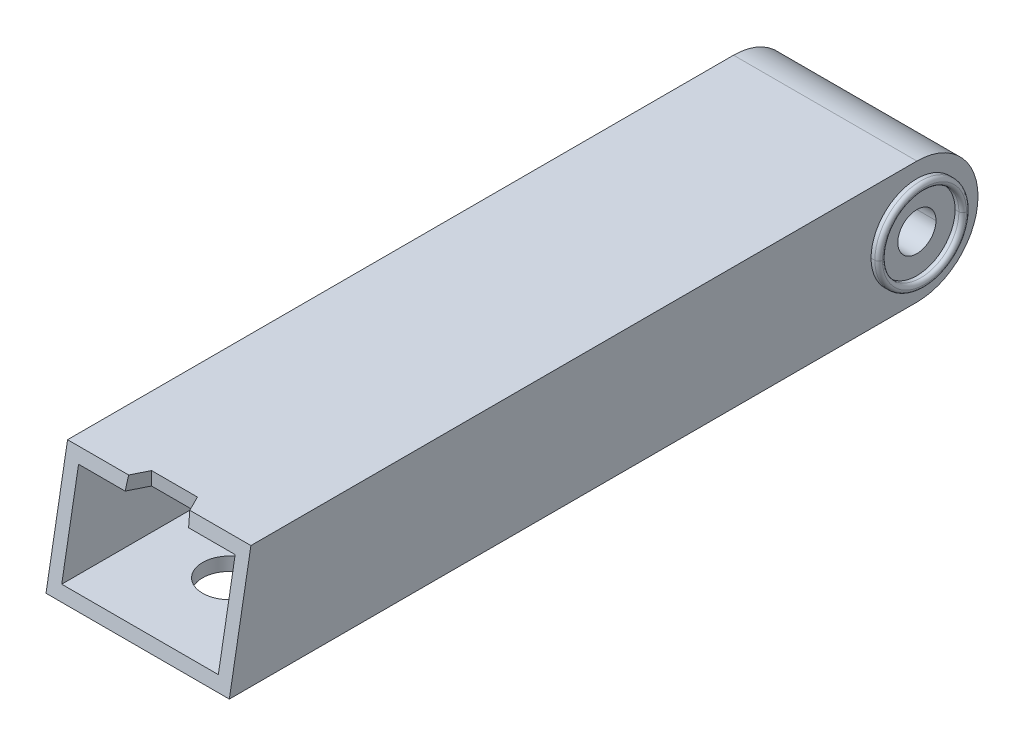
ISO-10303-21;
HEADER;
FILE_DESCRIPTION(('STEP AP214'),'2;1');
FILE_NAME('part.step','',(''),(''),'','','');
FILE_SCHEMA(('AUTOMOTIVE_DESIGN { 1 0 10303 214 1 1 1 1 }'));
ENDSEC;
DATA;
#1=APPLICATION_CONTEXT('core data for automotive mechanical design processes');
#2=APPLICATION_PROTOCOL_DEFINITION('international standard','automotive_design',2000,#1);
#3=PRODUCT_CONTEXT('',#1,'mechanical');
#4=PRODUCT('Part','Part','',(#3));
#5=PRODUCT_RELATED_PRODUCT_CATEGORY('part','',(#4));
#6=PRODUCT_DEFINITION_FORMATION('','',#4);
#7=PRODUCT_DEFINITION_CONTEXT('part definition',#1,'design');
#8=PRODUCT_DEFINITION('design','',#6,#7);
#9=PRODUCT_DEFINITION_SHAPE('','',#8);
#10=(LENGTH_UNIT() NAMED_UNIT(*) SI_UNIT(.MILLI.,.METRE.));
#11=(NAMED_UNIT(*) PLANE_ANGLE_UNIT() SI_UNIT($,.RADIAN.));
#12=(NAMED_UNIT(*) SI_UNIT($,.STERADIAN.) SOLID_ANGLE_UNIT());
#13=UNCERTAINTY_MEASURE_WITH_UNIT(LENGTH_MEASURE(1.E-05),#10,'distance_accuracy_value','');
#14=(GEOMETRIC_REPRESENTATION_CONTEXT(3) GLOBAL_UNCERTAINTY_ASSIGNED_CONTEXT((#13)) GLOBAL_UNIT_ASSIGNED_CONTEXT((#10,
#11,#12)) REPRESENTATION_CONTEXT('',''));
#15=CARTESIAN_POINT('',(0.,0.,0.));
#16=DIRECTION('',(0.,0.,1.));
#17=DIRECTION('',(1.,0.,0.));
#18=AXIS2_PLACEMENT_3D('',#15,#16,#17);
#19=CARTESIAN_POINT('',(9.,6.,85.1787683086646));
#20=DIRECTION('',(0.,0.,-1.));
#21=DIRECTION('',(0.,-1.,0.));
#22=AXIS2_PLACEMENT_3D('',#19,#20,#21);
#23=PLANE('',#22);
#24=DIRECTION('',(1.,0.,0.));
#25=VECTOR('',#24,1.);
#26=CARTESIAN_POINT('',(1.75,14.25,85.1787683086646));
#27=LINE('',#26,#25);
#28=CARTESIAN_POINT('',(9.,14.25,85.1787683086646));
#29=VERTEX_POINT('',#28);
#30=CARTESIAN_POINT('',(15.,14.25,85.1787683086646));
#31=VERTEX_POINT('',#30);
#32=EDGE_CURVE('E321',#29,#31,#27,.T.);
#33=ORIENTED_EDGE('',*,*,#32,.T.);
#34=DIRECTION('',(0.,1.,0.));
#35=VECTOR('',#34,1.);
#36=CARTESIAN_POINT('',(15.,6.,85.1787683086646));
#37=LINE('',#36,#35);
#38=CARTESIAN_POINT('',(15.,16.,85.1787683086646));
#39=VERTEX_POINT('',#38);
#40=EDGE_CURVE('E11',#31,#39,#37,.T.);
#41=ORIENTED_EDGE('',*,*,#40,.T.);
#42=DIRECTION('',(-1.,0.,0.));
#43=VECTOR('',#42,1.);
#44=CARTESIAN_POINT('',(9.,16.,85.1787683086646));
#45=LINE('',#44,#43);
#46=CARTESIAN_POINT('',(9.,16.,85.1787683086646));
#47=VERTEX_POINT('',#46);
#48=EDGE_CURVE('E415',#39,#47,#45,.T.);
#49=ORIENTED_EDGE('',*,*,#48,.T.);
#50=DIRECTION('',(0.,1.,0.));
#51=VECTOR('',#50,1.);
#52=CARTESIAN_POINT('',(9.,6.,85.1787683086646));
#53=LINE('',#52,#51);
#54=EDGE_CURVE('E27',#29,#47,#53,.T.);
#55=ORIENTED_EDGE('',*,*,#54,.F.);
#56=EDGE_LOOP('',(#33,#41,#49,#55));
#57=FACE_BOUND('',#56,.T.);
#58=ADVANCED_FACE('F16',(#57),#23,.F.);
#59=CARTESIAN_POINT('',(15.,6.,85.1787683086646));
#60=DIRECTION('',(0.894427190999916,0.,-0.447213595499958));
#61=DIRECTION('',(0.,-1.,0.));
#62=AXIS2_PLACEMENT_3D('',#59,#60,#61);
#63=PLANE('',#62);
#64=DIRECTION('',(-0.447213595499958,0.,-0.894427190999916));
#65=VECTOR('',#64,1.);
#66=CARTESIAN_POINT('',(15.,16.,85.1787683086646));
#67=LINE('',#66,#65);
#68=CARTESIAN_POINT('',(16.,16.,87.1787683086646));
#69=VERTEX_POINT('',#68);
#70=EDGE_CURVE('E372',#69,#39,#67,.T.);
#71=ORIENTED_EDGE('',*,*,#70,.T.);
#72=ORIENTED_EDGE('',*,*,#40,.F.);
#73=DIRECTION('',(0.447213595499958,0.,0.894427190999916));
#74=VECTOR('',#73,1.);
#75=CARTESIAN_POINT('',(14.2784926765342,14.25,83.7357536617329));
#76=LINE('',#75,#74);
#77=CARTESIAN_POINT('',(16.1542861081199,14.25,87.4873405249044));
#78=VERTEX_POINT('',#77);
#79=EDGE_CURVE('E375',#31,#78,#76,.T.);
#80=ORIENTED_EDGE('',*,*,#79,.T.);
#81=DIRECTION('',(0.086498669216755,-0.981116660300217,0.17299733843351));
#82=VECTOR('',#81,1.);
#83=CARTESIAN_POINT('',(16.0673381779864,15.2362124308388,87.3134446646374));
#84=LINE('',#83,#82);
#85=EDGE_CURVE('E280',#69,#78,#84,.T.);
#86=ORIENTED_EDGE('',*,*,#85,.F.);
#87=EDGE_LOOP('',(#71,#72,#80,#86));
#88=FACE_BOUND('',#87,.T.);
#89=ADVANCED_FACE('F1058',(#88),#63,.F.);
#90=CARTESIAN_POINT('',(6.,6.,91.1787683086646));
#91=DIRECTION('',(-0.894427190999916,0.,-0.447213595499958));
#92=DIRECTION('',(-0.447213595499958,0.,0.894427190999916));
#93=AXIS2_PLACEMENT_3D('',#90,#91,#92);
#94=PLANE('',#93);
#95=DIRECTION('',(0.447213595499958,0.,-0.894427190999916));
#96=VECTOR('',#95,1.);
#97=CARTESIAN_POINT('',(5.62150732346583,14.25,91.9357536617329));
#98=LINE('',#97,#96);
#99=CARTESIAN_POINT('',(7.8457138918801,14.25,87.4873405249044));
#100=VERTEX_POINT('',#99);
#101=EDGE_CURVE('E318',#100,#29,#98,.T.);
#102=ORIENTED_EDGE('',*,*,#101,.T.);
#103=ORIENTED_EDGE('',*,*,#54,.T.);
#104=DIRECTION('',(-0.447213595499958,0.,0.894427190999916));
#105=VECTOR('',#104,1.);
#106=CARTESIAN_POINT('',(6.,16.,91.1787683086646));
#107=LINE('',#106,#105);
#108=CARTESIAN_POINT('',(8.,16.,87.1787683086646));
#109=VERTEX_POINT('',#108);
#110=EDGE_CURVE('E293',#47,#109,#107,.T.);
#111=ORIENTED_EDGE('',*,*,#110,.T.);
#112=DIRECTION('',(0.086498669216755,0.981116660300217,-0.17299733843351));
#113=VECTOR('',#112,1.);
#114=CARTESIAN_POINT('',(8.12719433619659,17.4427098528601,86.9243796362714));
#115=LINE('',#114,#113);
#116=EDGE_CURVE('E408',#100,#109,#115,.T.);
#117=ORIENTED_EDGE('',*,*,#116,.F.);
#118=EDGE_LOOP('',(#102,#103,#111,#117));
#119=FACE_BOUND('',#118,.T.);
#120=ADVANCED_FACE('F706',(#119),#94,.F.);
#121=CARTESIAN_POINT('',(24.5,8.,0.));
#122=DIRECTION('',(1.,0.,0.));
#123=DIRECTION('',(0.,0.,-1.));
#124=AXIS2_PLACEMENT_3D('',#121,#122,#123);
#125=TOROIDAL_SURFACE('',#124,5.5,0.5);
#126=CARTESIAN_POINT('',(24.5,8.,5.5));
#127=DIRECTION('',(0.,1.,0.));
#128=DIRECTION('',(0.,0.,1.));
#129=AXIS2_PLACEMENT_3D('',#126,#127,#128);
#130=CIRCLE('',#129,0.5);
#131=CARTESIAN_POINT('',(25.,8.,5.5));
#132=VERTEX_POINT('',#131);
#133=CARTESIAN_POINT('',(24.5,8.,5.));
#134=VERTEX_POINT('',#133);
#135=EDGE_CURVE('E328',#132,#134,#130,.T.);
#136=ORIENTED_EDGE('',*,*,#135,.F.);
#137=CARTESIAN_POINT('',(25.,8.,0.));
#138=DIRECTION('',(1.,0.,0.));
#139=DIRECTION('',(0.,0.,-1.));
#140=AXIS2_PLACEMENT_3D('',#137,#138,#139);
#141=CIRCLE('',#140,5.5);
#142=CARTESIAN_POINT('',(25.,8.,-5.5));
#143=VERTEX_POINT('',#142);
#144=EDGE_CURVE('E448',#132,#143,#141,.T.);
#145=ORIENTED_EDGE('',*,*,#144,.T.);
#146=CARTESIAN_POINT('',(24.5,8.,-5.5));
#147=DIRECTION('',(0.,-1.,0.));
#148=DIRECTION('',(0.,0.,-1.));
#149=AXIS2_PLACEMENT_3D('',#146,#147,#148);
#150=CIRCLE('',#149,0.5);
#151=CARTESIAN_POINT('',(24.5,8.,-5.));
#152=VERTEX_POINT('',#151);
#153=EDGE_CURVE('E337',#143,#152,#150,.T.);
#154=ORIENTED_EDGE('',*,*,#153,.T.);
#155=CARTESIAN_POINT('',(24.5,8.,0.));
#156=DIRECTION('',(1.,0.,0.));
#157=DIRECTION('',(0.,0.,-1.));
#158=AXIS2_PLACEMENT_3D('',#155,#156,#157);
#159=CIRCLE('',#158,5.);
#160=EDGE_CURVE('E392',#134,#152,#159,.T.);
#161=ORIENTED_EDGE('',*,*,#160,.F.);
#162=EDGE_LOOP('',(#136,#145,#154,#161));
#163=FACE_BOUND('',#162,.T.);
#164=ADVANCED_FACE('F674',(#163),#125,.T.);
#165=CARTESIAN_POINT('',(24.5,8.,0.));
#166=DIRECTION('',(1.,0.,0.));
#167=DIRECTION('',(0.,0.,-1.));
#168=AXIS2_PLACEMENT_3D('',#165,#166,#167);
#169=TOROIDAL_SURFACE('',#168,5.5,0.5);
#170=CARTESIAN_POINT('',(24.5,8.,5.5));
#171=DIRECTION('',(0.,1.,0.));
#172=DIRECTION('',(0.,0.,1.));
#173=AXIS2_PLACEMENT_3D('',#170,#171,#172);
#174=CIRCLE('',#173,0.5);
#175=CARTESIAN_POINT('',(24.5,8.,6.));
#176=VERTEX_POINT('',#175);
#177=EDGE_CURVE('E294',#176,#132,#174,.T.);
#178=ORIENTED_EDGE('',*,*,#177,.F.);
#179=CARTESIAN_POINT('',(24.5,8.,0.));
#180=DIRECTION('',(-1.,0.,0.));
#181=DIRECTION('',(0.,0.,-1.));
#182=AXIS2_PLACEMENT_3D('',#179,#180,#181);
#183=CIRCLE('',#182,6.);
#184=CARTESIAN_POINT('',(24.5,8.,-6.));
#185=VERTEX_POINT('',#184);
#186=EDGE_CURVE('E309',#185,#176,#183,.T.);
#187=ORIENTED_EDGE('',*,*,#186,.F.);
#188=CARTESIAN_POINT('',(24.5,8.,-5.5));
#189=DIRECTION('',(0.,-1.,0.));
#190=DIRECTION('',(0.,0.,-1.));
#191=AXIS2_PLACEMENT_3D('',#188,#189,#190);
#192=CIRCLE('',#191,0.5);
#193=EDGE_CURVE('E298',#185,#143,#192,.T.);
#194=ORIENTED_EDGE('',*,*,#193,.T.);
#195=ORIENTED_EDGE('',*,*,#144,.F.);
#196=EDGE_LOOP('',(#178,#187,#194,#195));
#197=FACE_BOUND('',#196,.T.);
#198=ADVANCED_FACE('F663',(#197),#169,.T.);
#199=CARTESIAN_POINT('',(-0.5,8.,0.));
#200=DIRECTION('',(-1.,0.,0.));
#201=DIRECTION('',(0.,0.,1.));
#202=AXIS2_PLACEMENT_3D('',#199,#200,#201);
#203=TOROIDAL_SURFACE('',#202,5.5,0.5);
#204=CARTESIAN_POINT('',(-0.5,8.,-5.5));
#205=DIRECTION('',(0.,1.,0.));
#206=DIRECTION('',(0.,0.,1.));
#207=AXIS2_PLACEMENT_3D('',#204,#205,#206);
#208=CIRCLE('',#207,0.5);
#209=CARTESIAN_POINT('',(-0.5,8.,-6.));
#210=VERTEX_POINT('',#209);
#211=CARTESIAN_POINT('',(-1.,8.,-5.5));
#212=VERTEX_POINT('',#211);
#213=EDGE_CURVE('E364',#210,#212,#208,.T.);
#214=ORIENTED_EDGE('',*,*,#213,.F.);
#215=CARTESIAN_POINT('',(-0.5,8.,0.));
#216=DIRECTION('',(1.,0.,0.));
#217=DIRECTION('',(0.,0.,1.));
#218=AXIS2_PLACEMENT_3D('',#215,#216,#217);
#219=CIRCLE('',#218,6.);
#220=CARTESIAN_POINT('',(-0.5,8.,6.));
#221=VERTEX_POINT('',#220);
#222=EDGE_CURVE('E412',#221,#210,#219,.T.);
#223=ORIENTED_EDGE('',*,*,#222,.F.);
#224=CARTESIAN_POINT('',(-0.5,8.,5.5));
#225=DIRECTION('',(0.,-1.,0.));
#226=DIRECTION('',(0.,0.,-1.));
#227=AXIS2_PLACEMENT_3D('',#224,#225,#226);
#228=CIRCLE('',#227,0.5);
#229=CARTESIAN_POINT('',(-1.,8.,5.5));
#230=VERTEX_POINT('',#229);
#231=EDGE_CURVE('E460',#221,#230,#228,.T.);
#232=ORIENTED_EDGE('',*,*,#231,.T.);
#233=CARTESIAN_POINT('',(-1.,8.,0.));
#234=DIRECTION('',(-1.,0.,0.));
#235=DIRECTION('',(0.,0.,1.));
#236=AXIS2_PLACEMENT_3D('',#233,#234,#235);
#237=CIRCLE('',#236,5.5);
#238=EDGE_CURVE('E409',#212,#230,#237,.T.);
#239=ORIENTED_EDGE('',*,*,#238,.F.);
#240=EDGE_LOOP('',(#214,#223,#232,#239));
#241=FACE_BOUND('',#240,.T.);
#242=ADVANCED_FACE('F474',(#241),#203,.T.);
#243=CARTESIAN_POINT('',(12.,10.,78.));
#244=DIRECTION('',(0.,-1.,0.));
#245=DIRECTION('',(0.,0.,-1.));
#246=AXIS2_PLACEMENT_3D('',#243,#244,#245);
#247=CYLINDRICAL_SURFACE('',#246,3.5);
#248=DIRECTION('',(0.,-1.,0.));
#249=VECTOR('',#248,1.);
#250=CARTESIAN_POINT('',(12.,10.,81.5));
#251=LINE('',#250,#249);
#252=CARTESIAN_POINT('',(12.,1.75,81.5));
#253=VERTEX_POINT('',#252);
#254=CARTESIAN_POINT('',(12.,0.,81.5));
#255=VERTEX_POINT('',#254);
#256=EDGE_CURVE('E444',#253,#255,#251,.T.);
#257=ORIENTED_EDGE('',*,*,#256,.F.);
#258=CARTESIAN_POINT('',(12.,1.75,78.));
#259=DIRECTION('',(0.,1.,0.));
#260=DIRECTION('',(-1.,0.,0.));
#261=AXIS2_PLACEMENT_3D('',#258,#259,#260);
#262=CIRCLE('',#261,3.5);
#263=CARTESIAN_POINT('',(12.,1.75,74.5));
#264=VERTEX_POINT('',#263);
#265=EDGE_CURVE('E163',#253,#264,#262,.T.);
#266=ORIENTED_EDGE('',*,*,#265,.T.);
#267=DIRECTION('',(0.,-1.,0.));
#268=VECTOR('',#267,1.);
#269=CARTESIAN_POINT('',(12.,10.,74.5));
#270=LINE('',#269,#268);
#271=CARTESIAN_POINT('',(12.,0.,74.5));
#272=VERTEX_POINT('',#271);
#273=EDGE_CURVE('E284',#264,#272,#270,.T.);
#274=ORIENTED_EDGE('',*,*,#273,.T.);
#275=CARTESIAN_POINT('',(12.,0.,78.));
#276=DIRECTION('',(0.,-1.,0.));
#277=DIRECTION('',(0.,0.,-1.));
#278=AXIS2_PLACEMENT_3D('',#275,#276,#277);
#279=CIRCLE('',#278,3.5);
#280=EDGE_CURVE('E397',#272,#255,#279,.T.);
#281=ORIENTED_EDGE('',*,*,#280,.T.);
#282=EDGE_LOOP('',(#257,#266,#274,#281));
#283=FACE_BOUND('',#282,.T.);
#284=ADVANCED_FACE('F1043',(#283),#247,.F.);
#285=CARTESIAN_POINT('',(1.75,1.75,90.));
#286=DIRECTION('',(1.,0.,0.));
#287=DIRECTION('',(0.,1.,0.));
#288=AXIS2_PLACEMENT_3D('',#285,#286,#287);
#289=PLANE('',#288);
#290=DIRECTION('',(0.,0.984807753012208,-0.17364817766693));
#291=VECTOR('',#290,1.);
#292=CARTESIAN_POINT('',(1.75,1.69723104318767,89.70073237459));
#293=LINE('',#292,#291);
#294=CARTESIAN_POINT('',(1.75,1.75,89.6914277837602));
#295=VERTEX_POINT('',#294);
#296=CARTESIAN_POINT('',(1.75,14.25,87.4873405249044));
#297=VERTEX_POINT('',#296);
#298=EDGE_CURVE('E255',#295,#297,#293,.T.);
#299=ORIENTED_EDGE('',*,*,#298,.F.);
#300=DIRECTION('',(0.,0.,-1.));
#301=VECTOR('',#300,1.);
#302=CARTESIAN_POINT('',(1.75,1.75,90.));
#303=LINE('',#302,#301);
#304=CARTESIAN_POINT('',(1.75,1.75,4.99374608885958));
#305=VERTEX_POINT('',#304);
#306=EDGE_CURVE('E241',#295,#305,#303,.T.);
#307=ORIENTED_EDGE('',*,*,#306,.T.);
#308=CARTESIAN_POINT('',(1.75,8.,0.));
#309=DIRECTION('',(1.,0.,0.));
#310=DIRECTION('',(0.,0.,-1.));
#311=AXIS2_PLACEMENT_3D('',#308,#309,#310);
#312=CIRCLE('',#311,8.);
#313=CARTESIAN_POINT('',(1.75,14.25,4.99374608885955));
#314=VERTEX_POINT('',#313);
#315=EDGE_CURVE('E314',#314,#305,#312,.T.);
#316=ORIENTED_EDGE('',*,*,#315,.F.);
#317=DIRECTION('',(0.,0.,-1.));
#318=VECTOR('',#317,1.);
#319=CARTESIAN_POINT('',(1.75,14.25,90.));
#320=LINE('',#319,#318);
#321=EDGE_CURVE('E257',#297,#314,#320,.T.);
#322=ORIENTED_EDGE('',*,*,#321,.F.);
#323=EDGE_LOOP('',(#299,#307,#316,#322));
#324=FACE_BOUND('',#323,.T.);
#325=ADVANCED_FACE('F256',(#324),#289,.T.);
#326=CARTESIAN_POINT('',(1.75,1.75,90.));
#327=DIRECTION('',(0.,1.,0.));
#328=DIRECTION('',(1.,0.,0.));
#329=AXIS2_PLACEMENT_3D('',#326,#327,#328);
#330=PLANE('',#329);
#331=CARTESIAN_POINT('',(12.,1.75,78.));
#332=DIRECTION('',(0.,1.,0.));
#333=DIRECTION('',(-1.,0.,0.));
#334=AXIS2_PLACEMENT_3D('',#331,#332,#333);
#335=CIRCLE('',#334,3.5);
#336=EDGE_CURVE('E691',#264,#253,#335,.T.);
#337=ORIENTED_EDGE('',*,*,#336,.F.);
#338=ORIENTED_EDGE('',*,*,#265,.F.);
#339=EDGE_LOOP('',(#337,#338));
#340=FACE_BOUND('',#339,.T.);
#341=DIRECTION('',(-1.,0.,0.));
#342=VECTOR('',#341,1.);
#343=CARTESIAN_POINT('',(1.75,1.75,89.6914277837602));
#344=LINE('',#343,#342);
#345=CARTESIAN_POINT('',(22.25,1.75,89.6914277837602));
#346=VERTEX_POINT('',#345);
#347=EDGE_CURVE('E20',#346,#295,#344,.T.);
#348=ORIENTED_EDGE('',*,*,#347,.F.);
#349=DIRECTION('',(0.,0.,-1.));
#350=VECTOR('',#349,1.);
#351=CARTESIAN_POINT('',(22.25,1.75,90.));
#352=LINE('',#351,#350);
#353=CARTESIAN_POINT('',(22.25,1.75,4.99374608885955));
#354=VERTEX_POINT('',#353);
#355=EDGE_CURVE('E233',#346,#354,#352,.T.);
#356=ORIENTED_EDGE('',*,*,#355,.T.);
#357=DIRECTION('',(1.,0.,0.));
#358=VECTOR('',#357,1.);
#359=CARTESIAN_POINT('',(-22.6274169979695,1.75,4.99374608885955));
#360=LINE('',#359,#358);
#361=EDGE_CURVE('E247',#305,#354,#360,.T.);
#362=ORIENTED_EDGE('',*,*,#361,.F.);
#363=ORIENTED_EDGE('',*,*,#306,.F.);
#364=EDGE_LOOP('',(#348,#356,#362,#363));
#365=FACE_BOUND('',#364,.T.);
#366=ADVANCED_FACE('F243',(#340,#365),#330,.T.);
#367=CARTESIAN_POINT('',(22.25,1.75,90.));
#368=DIRECTION('',(-1.,0.,0.));
#369=DIRECTION('',(0.,0.,1.));
#370=AXIS2_PLACEMENT_3D('',#367,#368,#369);
#371=PLANE('',#370);
#372=DIRECTION('',(0.,-0.984807753012208,0.17364817766693));
#373=VECTOR('',#372,1.);
#374=CARTESIAN_POINT('',(22.25,1.69723104318767,89.70073237459));
#375=LINE('',#374,#373);
#376=CARTESIAN_POINT('',(22.25,14.25,87.4873405249044));
#377=VERTEX_POINT('',#376);
#378=EDGE_CURVE('E266',#377,#346,#375,.T.);
#379=ORIENTED_EDGE('',*,*,#378,.F.);
#380=DIRECTION('',(0.,0.,-1.));
#381=VECTOR('',#380,1.);
#382=CARTESIAN_POINT('',(22.25,14.25,90.));
#383=LINE('',#382,#381);
#384=CARTESIAN_POINT('',(22.25,14.25,4.99374608885958));
#385=VERTEX_POINT('',#384);
#386=EDGE_CURVE('E451',#377,#385,#383,.T.);
#387=ORIENTED_EDGE('',*,*,#386,.T.);
#388=CARTESIAN_POINT('',(22.25,8.,0.));
#389=DIRECTION('',(-1.,0.,0.));
#390=DIRECTION('',(0.,0.,1.));
#391=AXIS2_PLACEMENT_3D('',#388,#389,#390);
#392=CIRCLE('',#391,8.);
#393=EDGE_CURVE('E313',#354,#385,#392,.T.);
#394=ORIENTED_EDGE('',*,*,#393,.F.);
#395=ORIENTED_EDGE('',*,*,#355,.F.);
#396=EDGE_LOOP('',(#379,#387,#394,#395));
#397=FACE_BOUND('',#396,.T.);
#398=ADVANCED_FACE('F555',(#397),#371,.T.);
#399=CARTESIAN_POINT('',(1.75,14.25,90.));
#400=DIRECTION('',(0.,-1.,0.));
#401=DIRECTION('',(0.,0.,-1.));
#402=AXIS2_PLACEMENT_3D('',#399,#400,#401);
#403=PLANE('',#402);
#404=ORIENTED_EDGE('',*,*,#101,.F.);
#405=DIRECTION('',(1.,0.,0.));
#406=VECTOR('',#405,1.);
#407=CARTESIAN_POINT('',(1.75,14.25,87.4873405249044));
#408=LINE('',#407,#406);
#409=EDGE_CURVE('E518',#297,#100,#408,.T.);
#410=ORIENTED_EDGE('',*,*,#409,.F.);
#411=ORIENTED_EDGE('',*,*,#321,.T.);
#412=DIRECTION('',(-1.,0.,0.));
#413=VECTOR('',#412,1.);
#414=CARTESIAN_POINT('',(-22.6274169979695,14.25,4.99374608885955));
#415=LINE('',#414,#413);
#416=EDGE_CURVE('E262',#385,#314,#415,.T.);
#417=ORIENTED_EDGE('',*,*,#416,.F.);
#418=ORIENTED_EDGE('',*,*,#386,.F.);
#419=DIRECTION('',(1.,0.,0.));
#420=VECTOR('',#419,1.);
#421=CARTESIAN_POINT('',(1.75,14.25,87.4873405249044));
#422=LINE('',#421,#420);
#423=EDGE_CURVE('E273',#78,#377,#422,.T.);
#424=ORIENTED_EDGE('',*,*,#423,.F.);
#425=ORIENTED_EDGE('',*,*,#79,.F.);
#426=ORIENTED_EDGE('',*,*,#32,.F.);
#427=EDGE_LOOP('',(#404,#410,#411,#417,#418,#424,#425,#426));
#428=FACE_BOUND('',#427,.T.);
#429=ADVANCED_FACE('F553',(#428),#403,.T.);
#430=CARTESIAN_POINT('',(-22.6274169979695,8.,0.));
#431=DIRECTION('',(1.,0.,0.));
#432=DIRECTION('',(0.,0.,-1.));
#433=AXIS2_PLACEMENT_3D('',#430,#431,#432);
#434=CYLINDRICAL_SURFACE('',#433,8.);
#435=ORIENTED_EDGE('',*,*,#416,.T.);
#436=ORIENTED_EDGE('',*,*,#315,.T.);
#437=ORIENTED_EDGE('',*,*,#361,.T.);
#438=ORIENTED_EDGE('',*,*,#393,.T.);
#439=EDGE_LOOP('',(#435,#436,#437,#438));
#440=FACE_BOUND('',#439,.T.);
#441=ADVANCED_FACE('F18',(#440),#434,.T.);
#442=CARTESIAN_POINT('',(25.,16.,87.1787683086646));
#443=DIRECTION('',(0.,-0.17364817766693,-0.984807753012208));
#444=DIRECTION('',(0.,-0.984807753012208,0.17364817766693));
#445=AXIS2_PLACEMENT_3D('',#442,#443,#444);
#446=PLANE('',#445);
#447=ORIENTED_EDGE('',*,*,#409,.T.);
#448=ORIENTED_EDGE('',*,*,#116,.T.);
#449=DIRECTION('',(-1.,0.,0.));
#450=VECTOR('',#449,1.);
#451=CARTESIAN_POINT('',(25.,16.,87.1787683086646));
#452=LINE('',#451,#450);
#453=CARTESIAN_POINT('',(0.,16.,87.1787683086646));
#454=VERTEX_POINT('',#453);
#455=EDGE_CURVE('E290',#109,#454,#452,.T.);
#456=ORIENTED_EDGE('',*,*,#455,.T.);
#457=DIRECTION('',(0.,-0.984807753012208,0.17364817766693));
#458=VECTOR('',#457,1.);
#459=CARTESIAN_POINT('',(0.,16.,87.1787683086646));
#460=LINE('',#459,#458);
#461=CARTESIAN_POINT('',(0.,0.,90.));
#462=VERTEX_POINT('',#461);
#463=EDGE_CURVE('E350',#454,#462,#460,.T.);
#464=ORIENTED_EDGE('',*,*,#463,.T.);
#465=DIRECTION('',(1.,0.,0.));
#466=VECTOR('',#465,1.);
#467=CARTESIAN_POINT('',(0.,0.,90.));
#468=LINE('',#467,#466);
#469=CARTESIAN_POINT('',(24.,0.,90.));
#470=VERTEX_POINT('',#469);
#471=EDGE_CURVE('E393',#462,#470,#468,.T.);
#472=ORIENTED_EDGE('',*,*,#471,.T.);
#473=DIRECTION('',(0.,-0.984807753012208,0.17364817766693));
#474=VECTOR('',#473,1.);
#475=CARTESIAN_POINT('',(24.,0.,90.));
#476=LINE('',#475,#474);
#477=CARTESIAN_POINT('',(24.,16.,87.1787683086646));
#478=VERTEX_POINT('',#477);
#479=EDGE_CURVE('E289',#478,#470,#476,.T.);
#480=ORIENTED_EDGE('',*,*,#479,.F.);
#481=DIRECTION('',(-1.,0.,0.));
#482=VECTOR('',#481,1.);
#483=CARTESIAN_POINT('',(25.,16.,87.1787683086646));
#484=LINE('',#483,#482);
#485=EDGE_CURVE('E324',#478,#69,#484,.T.);
#486=ORIENTED_EDGE('',*,*,#485,.T.);
#487=ORIENTED_EDGE('',*,*,#85,.T.);
#488=ORIENTED_EDGE('',*,*,#423,.T.);
#489=ORIENTED_EDGE('',*,*,#378,.T.);
#490=ORIENTED_EDGE('',*,*,#347,.T.);
#491=ORIENTED_EDGE('',*,*,#298,.T.);
#492=EDGE_LOOP('',(#447,#448,#456,#464,#472,#480,#486,#487,#488,#489,#490,#491));
#493=FACE_BOUND('',#492,.T.);
#494=ADVANCED_FACE('F264',(#493),#446,.F.);
#495=CARTESIAN_POINT('',(-1.,8.,0.));
#496=DIRECTION('',(1.,0.,0.));
#497=DIRECTION('',(0.,0.,-1.));
#498=AXIS2_PLACEMENT_3D('',#495,#496,#497);
#499=CYLINDRICAL_SURFACE('',#498,6.);
#500=DIRECTION('',(1.,0.,0.));
#501=VECTOR('',#500,1.);
#502=CARTESIAN_POINT('',(-1.,8.,6.));
#503=LINE('',#502,#501);
#504=CARTESIAN_POINT('',(0.,8.,6.));
#505=VERTEX_POINT('',#504);
#506=EDGE_CURVE('E381',#221,#505,#503,.T.);
#507=ORIENTED_EDGE('',*,*,#506,.F.);
#508=ORIENTED_EDGE('',*,*,#222,.T.);
#509=DIRECTION('',(1.,0.,0.));
#510=VECTOR('',#509,1.);
#511=CARTESIAN_POINT('',(-1.,8.,-6.));
#512=LINE('',#511,#510);
#513=CARTESIAN_POINT('',(0.,8.,-6.));
#514=VERTEX_POINT('',#513);
#515=EDGE_CURVE('E380',#210,#514,#512,.T.);
#516=ORIENTED_EDGE('',*,*,#515,.T.);
#517=CARTESIAN_POINT('',(0.,8.,0.));
#518=DIRECTION('',(-1.,0.,0.));
#519=DIRECTION('',(0.,0.,-1.));
#520=AXIS2_PLACEMENT_3D('',#517,#518,#519);
#521=CIRCLE('',#520,6.);
#522=EDGE_CURVE('E387',#514,#505,#521,.T.);
#523=ORIENTED_EDGE('',*,*,#522,.T.);
#524=EDGE_LOOP('',(#507,#508,#516,#523));
#525=FACE_BOUND('',#524,.T.);
#526=ADVANCED_FACE('F507',(#525),#499,.T.);
#527=CARTESIAN_POINT('',(-1.,8.,0.));
#528=DIRECTION('',(-1.,0.,0.));
#529=DIRECTION('',(0.,0.,1.));
#530=AXIS2_PLACEMENT_3D('',#527,#528,#529);
#531=PLANE('',#530);
#532=CARTESIAN_POINT('',(-1.,8.,0.));
#533=DIRECTION('',(-1.,0.,0.));
#534=DIRECTION('',(0.,0.,1.));
#535=AXIS2_PLACEMENT_3D('',#532,#533,#534);
#536=CIRCLE('',#535,2.5);
#537=CARTESIAN_POINT('',(-1.,8.,-2.5));
#538=VERTEX_POINT('',#537);
#539=CARTESIAN_POINT('',(-1.,8.,2.5));
#540=VERTEX_POINT('',#539);
#541=EDGE_CURVE('E349',#538,#540,#536,.T.);
#542=ORIENTED_EDGE('',*,*,#541,.F.);
#543=CARTESIAN_POINT('',(-1.,8.,0.));
#544=DIRECTION('',(-1.,0.,0.));
#545=DIRECTION('',(0.,0.,1.));
#546=AXIS2_PLACEMENT_3D('',#543,#544,#545);
#547=CIRCLE('',#546,2.5);
#548=EDGE_CURVE('E306',#540,#538,#547,.T.);
#549=ORIENTED_EDGE('',*,*,#548,.F.);
#550=EDGE_LOOP('',(#542,#549));
#551=FACE_BOUND('',#550,.T.);
#552=CARTESIAN_POINT('',(-1.,8.,0.));
#553=DIRECTION('',(-1.,0.,0.));
#554=DIRECTION('',(0.,0.,1.));
#555=AXIS2_PLACEMENT_3D('',#552,#553,#554);
#556=CIRCLE('',#555,5.5);
#557=EDGE_CURVE('E456',#230,#212,#556,.T.);
#558=ORIENTED_EDGE('',*,*,#557,.T.);
#559=ORIENTED_EDGE('',*,*,#238,.T.);
#560=EDGE_LOOP('',(#558,#559));
#561=FACE_BOUND('',#560,.T.);
#562=ADVANCED_FACE('F996',(#551,#561),#531,.T.);
#563=CARTESIAN_POINT('',(25.,8.,0.));
#564=DIRECTION('',(-1.,0.,0.));
#565=DIRECTION('',(0.,0.,1.));
#566=AXIS2_PLACEMENT_3D('',#563,#564,#565);
#567=CYLINDRICAL_SURFACE('',#566,5.);
#568=DIRECTION('',(-1.,0.,0.));
#569=VECTOR('',#568,1.);
#570=CARTESIAN_POINT('',(25.,8.,-5.));
#571=LINE('',#570,#569);
#572=CARTESIAN_POINT('',(24.,8.,-5.));
#573=VERTEX_POINT('',#572);
#574=EDGE_CURVE('E542',#152,#573,#571,.T.);
#575=ORIENTED_EDGE('',*,*,#574,.F.);
#576=CARTESIAN_POINT('',(24.5,8.,0.));
#577=DIRECTION('',(1.,0.,0.));
#578=DIRECTION('',(0.,0.,-1.));
#579=AXIS2_PLACEMENT_3D('',#576,#577,#578);
#580=CIRCLE('',#579,5.);
#581=EDGE_CURVE('E332',#152,#134,#580,.T.);
#582=ORIENTED_EDGE('',*,*,#581,.T.);
#583=DIRECTION('',(-1.,0.,0.));
#584=VECTOR('',#583,1.);
#585=CARTESIAN_POINT('',(25.,8.,5.));
#586=LINE('',#585,#584);
#587=CARTESIAN_POINT('',(24.,8.,5.));
#588=VERTEX_POINT('',#587);
#589=EDGE_CURVE('E305',#134,#588,#586,.T.);
#590=ORIENTED_EDGE('',*,*,#589,.T.);
#591=CARTESIAN_POINT('',(24.,8.,0.));
#592=DIRECTION('',(1.,0.,0.));
#593=DIRECTION('',(0.,0.,-1.));
#594=AXIS2_PLACEMENT_3D('',#591,#592,#593);
#595=CIRCLE('',#594,5.);
#596=EDGE_CURVE('E223',#573,#588,#595,.T.);
#597=ORIENTED_EDGE('',*,*,#596,.F.);
#598=EDGE_LOOP('',(#575,#582,#590,#597));
#599=FACE_BOUND('',#598,.T.);
#600=ADVANCED_FACE('F898',(#599),#567,.F.);
#601=CARTESIAN_POINT('',(25.,8.,0.));
#602=DIRECTION('',(-1.,0.,0.));
#603=DIRECTION('',(0.,0.,1.));
#604=AXIS2_PLACEMENT_3D('',#601,#602,#603);
#605=CYLINDRICAL_SURFACE('',#604,6.);
#606=DIRECTION('',(-1.,0.,0.));
#607=VECTOR('',#606,1.);
#608=CARTESIAN_POINT('',(25.,8.,-6.));
#609=LINE('',#608,#607);
#610=CARTESIAN_POINT('',(24.,8.,-6.));
#611=VERTEX_POINT('',#610);
#612=EDGE_CURVE('E300',#185,#611,#609,.T.);
#613=ORIENTED_EDGE('',*,*,#612,.F.);
#614=ORIENTED_EDGE('',*,*,#186,.T.);
#615=DIRECTION('',(-1.,0.,0.));
#616=VECTOR('',#615,1.);
#617=CARTESIAN_POINT('',(25.,8.,6.));
#618=LINE('',#617,#616);
#619=CARTESIAN_POINT('',(24.,8.,6.));
#620=VERTEX_POINT('',#619);
#621=EDGE_CURVE('E368',#176,#620,#618,.T.);
#622=ORIENTED_EDGE('',*,*,#621,.T.);
#623=CARTESIAN_POINT('',(24.,8.,0.));
#624=DIRECTION('',(1.,0.,0.));
#625=DIRECTION('',(0.,0.,1.));
#626=AXIS2_PLACEMENT_3D('',#623,#624,#625);
#627=CIRCLE('',#626,6.);
#628=EDGE_CURVE('E210',#620,#611,#627,.T.);
#629=ORIENTED_EDGE('',*,*,#628,.T.);
#630=EDGE_LOOP('',(#613,#614,#622,#629));
#631=FACE_BOUND('',#630,.T.);
#632=ADVANCED_FACE('F893',(#631),#605,.T.);
#633=CARTESIAN_POINT('',(-22.6274169979695,8.,0.));
#634=DIRECTION('',(1.,0.,0.));
#635=DIRECTION('',(0.,0.,-1.));
#636=AXIS2_PLACEMENT_3D('',#633,#634,#635);
#637=CYLINDRICAL_SURFACE('',#636,2.5);
#638=DIRECTION('',(1.,0.,0.));
#639=VECTOR('',#638,1.);
#640=CARTESIAN_POINT('',(-22.6274169979695,8.,2.5));
#641=LINE('',#640,#639);
#642=CARTESIAN_POINT('',(24.,8.,2.5));
#643=VERTEX_POINT('',#642);
#644=EDGE_CURVE('E344',#540,#643,#641,.T.);
#645=ORIENTED_EDGE('',*,*,#644,.F.);
#646=ORIENTED_EDGE('',*,*,#548,.T.);
#647=DIRECTION('',(1.,0.,0.));
#648=VECTOR('',#647,1.);
#649=CARTESIAN_POINT('',(-22.6274169979695,8.,-2.5));
#650=LINE('',#649,#648);
#651=CARTESIAN_POINT('',(24.,8.,-2.5));
#652=VERTEX_POINT('',#651);
#653=EDGE_CURVE('E359',#538,#652,#650,.T.);
#654=ORIENTED_EDGE('',*,*,#653,.T.);
#655=CARTESIAN_POINT('',(24.,8.,0.));
#656=DIRECTION('',(1.,0.,0.));
#657=DIRECTION('',(0.,0.,-1.));
#658=AXIS2_PLACEMENT_3D('',#655,#656,#657);
#659=CIRCLE('',#658,2.5);
#660=EDGE_CURVE('E386',#652,#643,#659,.T.);
#661=ORIENTED_EDGE('',*,*,#660,.T.);
#662=EDGE_LOOP('',(#645,#646,#654,#661));
#663=FACE_BOUND('',#662,.T.);
#664=ADVANCED_FACE('F897',(#663),#637,.F.);
#665=CARTESIAN_POINT('',(-22.6274169979695,8.,0.));
#666=DIRECTION('',(1.,0.,0.));
#667=DIRECTION('',(0.,0.,-1.));
#668=AXIS2_PLACEMENT_3D('',#665,#666,#667);
#669=CYLINDRICAL_SURFACE('',#668,8.);
#670=DIRECTION('',(1.,0.,0.));
#671=VECTOR('',#670,1.);
#672=CARTESIAN_POINT('',(-22.6274169979695,8.,-8.));
#673=LINE('',#672,#671);
#674=CARTESIAN_POINT('',(0.,8.,-8.));
#675=VERTEX_POINT('',#674);
#676=CARTESIAN_POINT('',(24.,8.,-8.));
#677=VERTEX_POINT('',#676);
#678=EDGE_CURVE('E343',#675,#677,#673,.T.);
#679=ORIENTED_EDGE('',*,*,#678,.F.);
#680=CARTESIAN_POINT('',(0.,8.,0.));
#681=DIRECTION('',(-1.,0.,0.));
#682=DIRECTION('',(0.,0.,-1.));
#683=AXIS2_PLACEMENT_3D('',#680,#681,#682);
#684=CIRCLE('',#683,8.);
#685=CARTESIAN_POINT('',(0.,16.,0.));
#686=VERTEX_POINT('',#685);
#687=EDGE_CURVE('E505',#686,#675,#684,.T.);
#688=ORIENTED_EDGE('',*,*,#687,.F.);
#689=DIRECTION('',(-1.,0.,0.));
#690=VECTOR('',#689,1.);
#691=CARTESIAN_POINT('',(0.,16.,0.));
#692=LINE('',#691,#690);
#693=CARTESIAN_POINT('',(24.,16.,0.));
#694=VERTEX_POINT('',#693);
#695=EDGE_CURVE('E310',#694,#686,#692,.T.);
#696=ORIENTED_EDGE('',*,*,#695,.F.);
#697=CARTESIAN_POINT('',(24.,8.,0.));
#698=DIRECTION('',(1.,0.,0.));
#699=DIRECTION('',(0.,0.,-1.));
#700=AXIS2_PLACEMENT_3D('',#697,#698,#699);
#701=CIRCLE('',#700,8.);
#702=EDGE_CURVE('E286',#677,#694,#701,.T.);
#703=ORIENTED_EDGE('',*,*,#702,.F.);
#704=EDGE_LOOP('',(#679,#688,#696,#703));
#705=FACE_BOUND('',#704,.T.);
#706=ADVANCED_FACE('F928',(#705),#669,.T.);
#707=CARTESIAN_POINT('',(0.,16.,90.));
#708=DIRECTION('',(0.,-1.,0.));
#709=DIRECTION('',(0.,0.,-1.));
#710=AXIS2_PLACEMENT_3D('',#707,#708,#709);
#711=PLANE('',#710);
#712=ORIENTED_EDGE('',*,*,#455,.F.);
#713=ORIENTED_EDGE('',*,*,#110,.F.);
#714=ORIENTED_EDGE('',*,*,#48,.F.);
#715=ORIENTED_EDGE('',*,*,#70,.F.);
#716=ORIENTED_EDGE('',*,*,#485,.F.);
#717=DIRECTION('',(0.,0.,-1.));
#718=VECTOR('',#717,1.);
#719=CARTESIAN_POINT('',(24.,16.,90.));
#720=LINE('',#719,#718);
#721=EDGE_CURVE('E421',#478,#694,#720,.T.);
#722=ORIENTED_EDGE('',*,*,#721,.T.);
#723=ORIENTED_EDGE('',*,*,#695,.T.);
#724=DIRECTION('',(0.,0.,-1.));
#725=VECTOR('',#724,1.);
#726=CARTESIAN_POINT('',(0.,16.,90.));
#727=LINE('',#726,#725);
#728=EDGE_CURVE('E354',#454,#686,#727,.T.);
#729=ORIENTED_EDGE('',*,*,#728,.F.);
#730=EDGE_LOOP('',(#712,#713,#714,#715,#716,#722,#723,#729));
#731=FACE_BOUND('',#730,.T.);
#732=ADVANCED_FACE('F709',(#731),#711,.F.);
#733=CARTESIAN_POINT('',(24.,0.,90.));
#734=DIRECTION('',(-1.,0.,0.));
#735=DIRECTION('',(0.,0.,1.));
#736=AXIS2_PLACEMENT_3D('',#733,#734,#735);
#737=PLANE('',#736);
#738=ORIENTED_EDGE('',*,*,#628,.F.);
#739=CARTESIAN_POINT('',(24.,8.,0.));
#740=DIRECTION('',(1.,0.,0.));
#741=DIRECTION('',(0.,0.,1.));
#742=AXIS2_PLACEMENT_3D('',#739,#740,#741);
#743=CIRCLE('',#742,6.);
#744=EDGE_CURVE('E304',#611,#620,#743,.T.);
#745=ORIENTED_EDGE('',*,*,#744,.F.);
#746=EDGE_LOOP('',(#738,#745));
#747=FACE_BOUND('',#746,.T.);
#748=ORIENTED_EDGE('',*,*,#721,.F.);
#749=ORIENTED_EDGE('',*,*,#479,.T.);
#750=DIRECTION('',(0.,0.,-1.));
#751=VECTOR('',#750,1.);
#752=CARTESIAN_POINT('',(24.,0.,90.));
#753=LINE('',#752,#751);
#754=CARTESIAN_POINT('',(24.,0.,0.));
#755=VERTEX_POINT('',#754);
#756=EDGE_CURVE('E398',#470,#755,#753,.T.);
#757=ORIENTED_EDGE('',*,*,#756,.T.);
#758=CARTESIAN_POINT('',(24.,8.,0.));
#759=DIRECTION('',(1.,0.,0.));
#760=DIRECTION('',(0.,0.,-1.));
#761=AXIS2_PLACEMENT_3D('',#758,#759,#760);
#762=CIRCLE('',#761,8.);
#763=EDGE_CURVE('E338',#755,#677,#762,.T.);
#764=ORIENTED_EDGE('',*,*,#763,.T.);
#765=ORIENTED_EDGE('',*,*,#702,.T.);
#766=EDGE_LOOP('',(#748,#749,#757,#764,#765));
#767=FACE_BOUND('',#766,.T.);
#768=ADVANCED_FACE('F927',(#747,#767),#737,.F.);
#769=CARTESIAN_POINT('',(0.,0.,90.));
#770=DIRECTION('',(0.,1.,0.));
#771=DIRECTION('',(1.,0.,0.));
#772=AXIS2_PLACEMENT_3D('',#769,#770,#771);
#773=PLANE('',#772);
#774=ORIENTED_EDGE('',*,*,#280,.F.);
#775=CARTESIAN_POINT('',(12.,0.,78.));
#776=DIRECTION('',(0.,-1.,0.));
#777=DIRECTION('',(0.,0.,-1.));
#778=AXIS2_PLACEMENT_3D('',#775,#776,#777);
#779=CIRCLE('',#778,3.5);
#780=EDGE_CURVE('E441',#255,#272,#779,.T.);
#781=ORIENTED_EDGE('',*,*,#780,.F.);
#782=EDGE_LOOP('',(#774,#781));
#783=FACE_BOUND('',#782,.T.);
#784=DIRECTION('',(1.,0.,0.));
#785=VECTOR('',#784,1.);
#786=CARTESIAN_POINT('',(0.,0.,0.));
#787=LINE('',#786,#785);
#788=CARTESIAN_POINT('',(0.,0.,0.));
#789=VERTEX_POINT('',#788);
#790=EDGE_CURVE('E342',#789,#755,#787,.T.);
#791=ORIENTED_EDGE('',*,*,#790,.T.);
#792=ORIENTED_EDGE('',*,*,#756,.F.);
#793=ORIENTED_EDGE('',*,*,#471,.F.);
#794=DIRECTION('',(0.,0.,-1.));
#795=VECTOR('',#794,1.);
#796=CARTESIAN_POINT('',(0.,0.,90.));
#797=LINE('',#796,#795);
#798=EDGE_CURVE('E355',#462,#789,#797,.T.);
#799=ORIENTED_EDGE('',*,*,#798,.T.);
#800=EDGE_LOOP('',(#791,#792,#793,#799));
#801=FACE_BOUND('',#800,.T.);
#802=ADVANCED_FACE('F978',(#783,#801),#773,.F.);
#803=CARTESIAN_POINT('',(24.,0.,90.));
#804=DIRECTION('',(-1.,0.,0.));
#805=DIRECTION('',(0.,0.,1.));
#806=AXIS2_PLACEMENT_3D('',#803,#804,#805);
#807=PLANE('',#806);
#808=ORIENTED_EDGE('',*,*,#660,.F.);
#809=CARTESIAN_POINT('',(24.,8.,0.));
#810=DIRECTION('',(1.,0.,0.));
#811=DIRECTION('',(0.,0.,-1.));
#812=AXIS2_PLACEMENT_3D('',#809,#810,#811);
#813=CIRCLE('',#812,2.5);
#814=EDGE_CURVE('E348',#643,#652,#813,.T.);
#815=ORIENTED_EDGE('',*,*,#814,.F.);
#816=EDGE_LOOP('',(#808,#815));
#817=FACE_BOUND('',#816,.T.);
#818=CARTESIAN_POINT('',(24.,8.,0.));
#819=DIRECTION('',(1.,0.,0.));
#820=DIRECTION('',(0.,0.,-1.));
#821=AXIS2_PLACEMENT_3D('',#818,#819,#820);
#822=CIRCLE('',#821,5.);
#823=EDGE_CURVE('E521',#588,#573,#822,.T.);
#824=ORIENTED_EDGE('',*,*,#823,.T.);
#825=ORIENTED_EDGE('',*,*,#596,.T.);
#826=EDGE_LOOP('',(#824,#825));
#827=FACE_BOUND('',#826,.T.);
#828=ADVANCED_FACE('F1081',(#817,#827),#807,.F.);
#829=CARTESIAN_POINT('',(0.,0.,90.));
#830=DIRECTION('',(1.,0.,0.));
#831=DIRECTION('',(0.,1.,0.));
#832=AXIS2_PLACEMENT_3D('',#829,#830,#831);
#833=PLANE('',#832);
#834=ORIENTED_EDGE('',*,*,#522,.F.);
#835=CARTESIAN_POINT('',(0.,8.,0.));
#836=DIRECTION('',(-1.,0.,0.));
#837=DIRECTION('',(0.,0.,-1.));
#838=AXIS2_PLACEMENT_3D('',#835,#836,#837);
#839=CIRCLE('',#838,6.);
#840=EDGE_CURVE('E376',#505,#514,#839,.T.);
#841=ORIENTED_EDGE('',*,*,#840,.F.);
#842=EDGE_LOOP('',(#834,#841));
#843=FACE_BOUND('',#842,.T.);
#844=ORIENTED_EDGE('',*,*,#798,.F.);
#845=ORIENTED_EDGE('',*,*,#463,.F.);
#846=ORIENTED_EDGE('',*,*,#728,.T.);
#847=ORIENTED_EDGE('',*,*,#687,.T.);
#848=CARTESIAN_POINT('',(0.,8.,0.));
#849=DIRECTION('',(-1.,0.,0.));
#850=DIRECTION('',(0.,0.,-1.));
#851=AXIS2_PLACEMENT_3D('',#848,#849,#850);
#852=CIRCLE('',#851,8.);
#853=EDGE_CURVE('E404',#675,#789,#852,.T.);
#854=ORIENTED_EDGE('',*,*,#853,.T.);
#855=EDGE_LOOP('',(#844,#845,#846,#847,#854));
#856=FACE_BOUND('',#855,.T.);
#857=ADVANCED_FACE('F501',(#843,#856),#833,.F.);
#858=CARTESIAN_POINT('',(-22.6274169979695,8.,0.));
#859=DIRECTION('',(1.,0.,0.));
#860=DIRECTION('',(0.,0.,-1.));
#861=AXIS2_PLACEMENT_3D('',#858,#859,#860);
#862=CYLINDRICAL_SURFACE('',#861,8.);
#863=ORIENTED_EDGE('',*,*,#853,.F.);
#864=ORIENTED_EDGE('',*,*,#678,.T.);
#865=ORIENTED_EDGE('',*,*,#763,.F.);
#866=ORIENTED_EDGE('',*,*,#790,.F.);
#867=EDGE_LOOP('',(#863,#864,#865,#866));
#868=FACE_BOUND('',#867,.T.);
#869=ADVANCED_FACE('F984',(#868),#862,.T.);
#870=CARTESIAN_POINT('',(-22.6274169979695,8.,0.));
#871=DIRECTION('',(1.,0.,0.));
#872=DIRECTION('',(0.,0.,-1.));
#873=AXIS2_PLACEMENT_3D('',#870,#871,#872);
#874=CYLINDRICAL_SURFACE('',#873,2.5);
#875=ORIENTED_EDGE('',*,*,#541,.T.);
#876=ORIENTED_EDGE('',*,*,#644,.T.);
#877=ORIENTED_EDGE('',*,*,#814,.T.);
#878=ORIENTED_EDGE('',*,*,#653,.F.);
#879=EDGE_LOOP('',(#875,#876,#877,#878));
#880=FACE_BOUND('',#879,.T.);
#881=ADVANCED_FACE('F961',(#880),#874,.F.);
#882=CARTESIAN_POINT('',(25.,8.,0.));
#883=DIRECTION('',(-1.,0.,0.));
#884=DIRECTION('',(0.,0.,1.));
#885=AXIS2_PLACEMENT_3D('',#882,#883,#884);
#886=CYLINDRICAL_SURFACE('',#885,6.);
#887=CARTESIAN_POINT('',(24.5,8.,0.));
#888=DIRECTION('',(-1.,0.,0.));
#889=DIRECTION('',(0.,0.,-1.));
#890=AXIS2_PLACEMENT_3D('',#887,#888,#889);
#891=CIRCLE('',#890,6.);
#892=EDGE_CURVE('E299',#176,#185,#891,.T.);
#893=ORIENTED_EDGE('',*,*,#892,.T.);
#894=ORIENTED_EDGE('',*,*,#612,.T.);
#895=ORIENTED_EDGE('',*,*,#744,.T.);
#896=ORIENTED_EDGE('',*,*,#621,.F.);
#897=EDGE_LOOP('',(#893,#894,#895,#896));
#898=FACE_BOUND('',#897,.T.);
#899=ADVANCED_FACE('F956',(#898),#886,.T.);
#900=CARTESIAN_POINT('',(25.,8.,0.));
#901=DIRECTION('',(-1.,0.,0.));
#902=DIRECTION('',(0.,0.,1.));
#903=AXIS2_PLACEMENT_3D('',#900,#901,#902);
#904=CYLINDRICAL_SURFACE('',#903,5.);
#905=ORIENTED_EDGE('',*,*,#160,.T.);
#906=ORIENTED_EDGE('',*,*,#574,.T.);
#907=ORIENTED_EDGE('',*,*,#823,.F.);
#908=ORIENTED_EDGE('',*,*,#589,.F.);
#909=EDGE_LOOP('',(#905,#906,#907,#908));
#910=FACE_BOUND('',#909,.T.);
#911=ADVANCED_FACE('F960',(#910),#904,.F.);
#912=CARTESIAN_POINT('',(-1.,8.,0.));
#913=DIRECTION('',(1.,0.,0.));
#914=DIRECTION('',(0.,0.,-1.));
#915=AXIS2_PLACEMENT_3D('',#912,#913,#914);
#916=CYLINDRICAL_SURFACE('',#915,6.);
#917=CARTESIAN_POINT('',(-0.5,8.,0.));
#918=DIRECTION('',(1.,0.,0.));
#919=DIRECTION('',(0.,0.,1.));
#920=AXIS2_PLACEMENT_3D('',#917,#918,#919);
#921=CIRCLE('',#920,6.);
#922=EDGE_CURVE('E360',#210,#221,#921,.T.);
#923=ORIENTED_EDGE('',*,*,#922,.T.);
#924=ORIENTED_EDGE('',*,*,#506,.T.);
#925=ORIENTED_EDGE('',*,*,#840,.T.);
#926=ORIENTED_EDGE('',*,*,#515,.F.);
#927=EDGE_LOOP('',(#923,#924,#925,#926));
#928=FACE_BOUND('',#927,.T.);
#929=ADVANCED_FACE('F509',(#928),#916,.T.);
#930=CARTESIAN_POINT('',(12.,10.,78.));
#931=DIRECTION('',(0.,-1.,0.));
#932=DIRECTION('',(0.,0.,-1.));
#933=AXIS2_PLACEMENT_3D('',#930,#931,#932);
#934=CYLINDRICAL_SURFACE('',#933,3.5);
#935=ORIENTED_EDGE('',*,*,#336,.T.);
#936=ORIENTED_EDGE('',*,*,#256,.T.);
#937=ORIENTED_EDGE('',*,*,#780,.T.);
#938=ORIENTED_EDGE('',*,*,#273,.F.);
#939=EDGE_LOOP('',(#935,#936,#937,#938));
#940=FACE_BOUND('',#939,.T.);
#941=ADVANCED_FACE('F947',(#940),#934,.F.);
#942=CARTESIAN_POINT('',(-0.5,8.,0.));
#943=DIRECTION('',(-1.,0.,0.));
#944=DIRECTION('',(0.,0.,1.));
#945=AXIS2_PLACEMENT_3D('',#942,#943,#944);
#946=TOROIDAL_SURFACE('',#945,5.5,0.5);
#947=ORIENTED_EDGE('',*,*,#922,.F.);
#948=ORIENTED_EDGE('',*,*,#213,.T.);
#949=ORIENTED_EDGE('',*,*,#557,.F.);
#950=ORIENTED_EDGE('',*,*,#231,.F.);
#951=EDGE_LOOP('',(#947,#948,#949,#950));
#952=FACE_BOUND('',#951,.T.);
#953=ADVANCED_FACE('F471',(#952),#946,.T.);
#954=CARTESIAN_POINT('',(24.5,8.,0.));
#955=DIRECTION('',(1.,0.,0.));
#956=DIRECTION('',(0.,0.,-1.));
#957=AXIS2_PLACEMENT_3D('',#954,#955,#956);
#958=TOROIDAL_SURFACE('',#957,5.5,0.5);
#959=ORIENTED_EDGE('',*,*,#892,.F.);
#960=ORIENTED_EDGE('',*,*,#177,.T.);
#961=CARTESIAN_POINT('',(25.,8.,0.));
#962=DIRECTION('',(1.,0.,0.));
#963=DIRECTION('',(0.,0.,-1.));
#964=AXIS2_PLACEMENT_3D('',#961,#962,#963);
#965=CIRCLE('',#964,5.5);
#966=EDGE_CURVE('E333',#143,#132,#965,.T.);
#967=ORIENTED_EDGE('',*,*,#966,.F.);
#968=ORIENTED_EDGE('',*,*,#193,.F.);
#969=EDGE_LOOP('',(#959,#960,#967,#968));
#970=FACE_BOUND('',#969,.T.);
#971=ADVANCED_FACE('F672',(#970),#958,.T.);
#972=CARTESIAN_POINT('',(24.5,8.,0.));
#973=DIRECTION('',(1.,0.,0.));
#974=DIRECTION('',(0.,0.,-1.));
#975=AXIS2_PLACEMENT_3D('',#972,#973,#974);
#976=TOROIDAL_SURFACE('',#975,5.5,0.5);
#977=ORIENTED_EDGE('',*,*,#966,.T.);
#978=ORIENTED_EDGE('',*,*,#135,.T.);
#979=ORIENTED_EDGE('',*,*,#581,.F.);
#980=ORIENTED_EDGE('',*,*,#153,.F.);
#981=EDGE_LOOP('',(#977,#978,#979,#980));
#982=FACE_BOUND('',#981,.T.);
#983=ADVANCED_FACE('F678',(#982),#976,.T.);
#984=CLOSED_SHELL('',(#58,#89,#120,#164,#198,#242,#284,#325,#366,#398,#429,#441,#494,#526,#562,
#600,#632,#664,#706,#732,#768,#802,#828,#857,#869,#881,#899,#911,#929,#941,#953,#971,#983));
#985=MANIFOLD_SOLID_BREP('B1',#984);
#986=ADVANCED_BREP_SHAPE_REPRESENTATION('',(#18,#985),#14);
#987=SHAPE_DEFINITION_REPRESENTATION(#9,#986);
ENDSEC;
END-ISO-10303-21;
